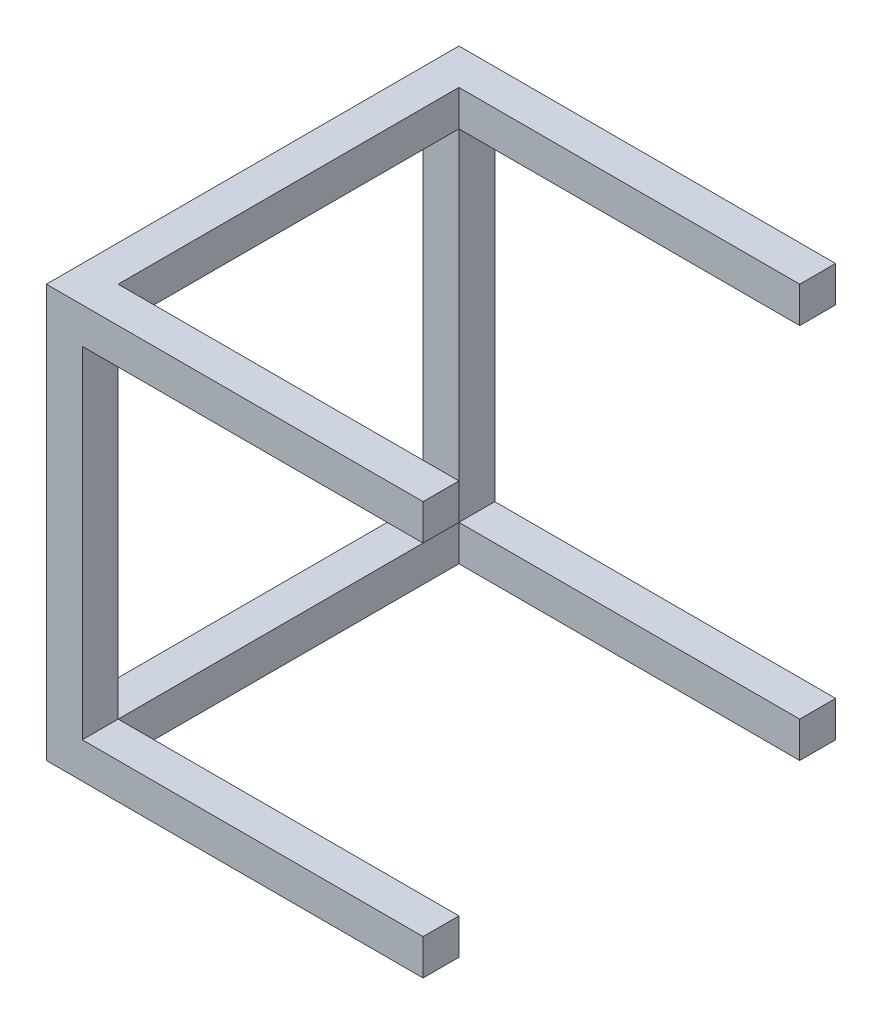
ISO-10303-21;
HEADER;
FILE_DESCRIPTION(('STEP AP214'),'2;1');
FILE_NAME('part.step','',(''),(''),'','','');
FILE_SCHEMA(('AUTOMOTIVE_DESIGN { 1 0 10303 214 1 1 1 1 }'));
ENDSEC;
DATA;
#1=APPLICATION_CONTEXT('core data for automotive mechanical design processes');
#2=APPLICATION_PROTOCOL_DEFINITION('international standard','automotive_design',2000,#1);
#3=PRODUCT_CONTEXT('',#1,'mechanical');
#4=PRODUCT('Part','Part','',(#3));
#5=PRODUCT_RELATED_PRODUCT_CATEGORY('part','',(#4));
#6=PRODUCT_DEFINITION_FORMATION('','',#4);
#7=PRODUCT_DEFINITION_CONTEXT('part definition',#1,'design');
#8=PRODUCT_DEFINITION('design','',#6,#7);
#9=PRODUCT_DEFINITION_SHAPE('','',#8);
#10=(LENGTH_UNIT() NAMED_UNIT(*) SI_UNIT(.MILLI.,.METRE.));
#11=(NAMED_UNIT(*) PLANE_ANGLE_UNIT() SI_UNIT($,.RADIAN.));
#12=(NAMED_UNIT(*) SI_UNIT($,.STERADIAN.) SOLID_ANGLE_UNIT());
#13=UNCERTAINTY_MEASURE_WITH_UNIT(LENGTH_MEASURE(1.E-05),#10,'distance_accuracy_value','');
#14=(GEOMETRIC_REPRESENTATION_CONTEXT(3) GLOBAL_UNCERTAINTY_ASSIGNED_CONTEXT((#13)) GLOBAL_UNIT_ASSIGNED_CONTEXT((#10,
#11,#12)) REPRESENTATION_CONTEXT('',''));
#15=CARTESIAN_POINT('',(0.,0.,0.));
#16=DIRECTION('',(0.,0.,1.));
#17=DIRECTION('',(1.,0.,0.));
#18=AXIS2_PLACEMENT_3D('',#15,#16,#17);
#19=CARTESIAN_POINT('',(40.,0.,0.));
#20=DIRECTION('',(-1.,0.,0.));
#21=DIRECTION('',(0.,0.,1.));
#22=AXIS2_PLACEMENT_3D('',#19,#20,#21);
#23=PLANE('',#22);
#24=DIRECTION('',(0.,1.,0.));
#25=VECTOR('',#24,1.);
#26=CARTESIAN_POINT('',(40.,25.5323898430656,-40.));
#27=LINE('',#26,#25);
#28=CARTESIAN_POINT('',(40.,25.5323898430656,-40.));
#29=VERTEX_POINT('',#28);
#30=CARTESIAN_POINT('',(40.,65.5323898430656,-40.));
#31=VERTEX_POINT('',#30);
#32=EDGE_CURVE('E181',#29,#31,#27,.T.);
#33=ORIENTED_EDGE('',*,*,#32,.F.);
#34=DIRECTION('',(0.,0.,-1.));
#35=VECTOR('',#34,1.);
#36=CARTESIAN_POINT('',(40.,25.5323898430656,0.));
#37=LINE('',#36,#35);
#38=CARTESIAN_POINT('',(40.,25.5323898430656,-420.));
#39=VERTEX_POINT('',#38);
#40=EDGE_CURVE('E165',#29,#39,#37,.T.);
#41=ORIENTED_EDGE('',*,*,#40,.T.);
#42=DIRECTION('',(0.,-1.,0.));
#43=VECTOR('',#42,1.);
#44=CARTESIAN_POINT('',(40.,25.5323898430656,-420.));
#45=LINE('',#44,#43);
#46=CARTESIAN_POINT('',(40.,65.5323898430656,-420.));
#47=VERTEX_POINT('',#46);
#48=EDGE_CURVE('E215',#47,#39,#45,.T.);
#49=ORIENTED_EDGE('',*,*,#48,.F.);
#50=DIRECTION('',(0.,0.,-1.));
#51=VECTOR('',#50,1.);
#52=CARTESIAN_POINT('',(40.,65.5323898430656,-40.));
#53=LINE('',#52,#51);
#54=EDGE_CURVE('E183',#31,#47,#53,.T.);
#55=ORIENTED_EDGE('',*,*,#54,.F.);
#56=EDGE_LOOP('',(#33,#41,#49,#55));
#57=FACE_BOUND('',#56,.T.);
#58=ADVANCED_FACE('F39',(#57),#23,.F.);
#59=DIRECTION('',(0.,0.,1.));
#60=VECTOR('',#59,1.);
#61=CARTESIAN_POINT('',(40.,65.5323898430656,0.));
#62=LINE('',#61,#60);
#63=CARTESIAN_POINT('',(40.,65.5323898430656,0.));
#64=VERTEX_POINT('',#63);
#65=EDGE_CURVE('E188',#31,#64,#62,.T.);
#66=ORIENTED_EDGE('',*,*,#65,.F.);
#67=DIRECTION('',(0.,-1.,0.));
#68=VECTOR('',#67,1.);
#69=CARTESIAN_POINT('',(40.,65.5323898430656,-40.));
#70=LINE('',#69,#68);
#71=CARTESIAN_POINT('',(40.,445.532389843066,-40.));
#72=VERTEX_POINT('',#71);
#73=EDGE_CURVE('E277',#72,#31,#70,.T.);
#74=ORIENTED_EDGE('',*,*,#73,.F.);
#75=DIRECTION('',(0.,0.,-1.));
#76=VECTOR('',#75,1.);
#77=CARTESIAN_POINT('',(40.,445.532389843066,0.));
#78=LINE('',#77,#76);
#79=CARTESIAN_POINT('',(40.,445.532389843066,0.));
#80=VERTEX_POINT('',#79);
#81=EDGE_CURVE('E244',#80,#72,#78,.T.);
#82=ORIENTED_EDGE('',*,*,#81,.F.);
#83=DIRECTION('',(0.,-1.,0.));
#84=VECTOR('',#83,1.);
#85=CARTESIAN_POINT('',(40.,25.5323898430656,0.));
#86=LINE('',#85,#84);
#87=EDGE_CURVE('E54',#80,#64,#86,.T.);
#88=ORIENTED_EDGE('',*,*,#87,.T.);
#89=EDGE_LOOP('',(#66,#74,#82,#88));
#90=FACE_BOUND('',#89,.T.);
#91=ADVANCED_FACE('F373',(#90),#23,.F.);
#92=DIRECTION('',(0.,0.,1.));
#93=VECTOR('',#92,1.);
#94=CARTESIAN_POINT('',(40.,65.5323898430656,-460.));
#95=LINE('',#94,#93);
#96=CARTESIAN_POINT('',(40.,65.5323898430656,-460.));
#97=VERTEX_POINT('',#96);
#98=EDGE_CURVE('E62',#97,#47,#95,.T.);
#99=ORIENTED_EDGE('',*,*,#98,.F.);
#100=DIRECTION('',(0.,1.,0.));
#101=VECTOR('',#100,1.);
#102=CARTESIAN_POINT('',(40.,25.5323898430656,-460.));
#103=LINE('',#102,#101);
#104=CARTESIAN_POINT('',(40.,445.532389843066,-460.));
#105=VERTEX_POINT('',#104);
#106=EDGE_CURVE('E309',#97,#105,#103,.T.);
#107=ORIENTED_EDGE('',*,*,#106,.T.);
#108=DIRECTION('',(0.,0.,-1.));
#109=VECTOR('',#108,1.);
#110=CARTESIAN_POINT('',(40.,445.532389843066,-460.));
#111=LINE('',#110,#109);
#112=CARTESIAN_POINT('',(40.,445.532389843066,-420.));
#113=VERTEX_POINT('',#112);
#114=EDGE_CURVE('E237',#113,#105,#111,.T.);
#115=ORIENTED_EDGE('',*,*,#114,.F.);
#116=DIRECTION('',(0.,1.,0.));
#117=VECTOR('',#116,1.);
#118=CARTESIAN_POINT('',(40.,65.5323898430656,-420.));
#119=LINE('',#118,#117);
#120=EDGE_CURVE('E282',#47,#113,#119,.T.);
#121=ORIENTED_EDGE('',*,*,#120,.F.);
#122=EDGE_LOOP('',(#99,#107,#115,#121));
#123=FACE_BOUND('',#122,.T.);
#124=ADVANCED_FACE('F356',(#123),#23,.F.);
#125=DIRECTION('',(0.,-1.,0.));
#126=VECTOR('',#125,1.);
#127=CARTESIAN_POINT('',(40.,485.532389843066,-420.));
#128=LINE('',#127,#126);
#129=CARTESIAN_POINT('',(40.,485.532389843066,-420.));
#130=VERTEX_POINT('',#129);
#131=EDGE_CURVE('E240',#130,#113,#128,.T.);
#132=ORIENTED_EDGE('',*,*,#131,.F.);
#133=DIRECTION('',(0.,0.,1.));
#134=VECTOR('',#133,1.);
#135=CARTESIAN_POINT('',(40.,485.532389843066,0.));
#136=LINE('',#135,#134);
#137=CARTESIAN_POINT('',(40.,485.532389843066,-40.));
#138=VERTEX_POINT('',#137);
#139=EDGE_CURVE('E311',#130,#138,#136,.T.);
#140=ORIENTED_EDGE('',*,*,#139,.T.);
#141=DIRECTION('',(0.,1.,0.));
#142=VECTOR('',#141,1.);
#143=CARTESIAN_POINT('',(40.,485.532389843066,-40.));
#144=LINE('',#143,#142);
#145=EDGE_CURVE('E256',#72,#138,#144,.T.);
#146=ORIENTED_EDGE('',*,*,#145,.F.);
#147=DIRECTION('',(0.,0.,1.));
#148=VECTOR('',#147,1.);
#149=CARTESIAN_POINT('',(40.,445.532389843066,-40.));
#150=LINE('',#149,#148);
#151=EDGE_CURVE('E285',#113,#72,#150,.T.);
#152=ORIENTED_EDGE('',*,*,#151,.F.);
#153=EDGE_LOOP('',(#132,#140,#146,#152));
#154=FACE_BOUND('',#153,.T.);
#155=ADVANCED_FACE('F375',(#154),#23,.F.);
#156=CARTESIAN_POINT('',(0.,0.,0.));
#157=DIRECTION('',(-1.,0.,0.));
#158=DIRECTION('',(0.,0.,1.));
#159=AXIS2_PLACEMENT_3D('',#156,#157,#158);
#160=PLANE('',#159);
#161=DIRECTION('',(0.,1.,0.));
#162=VECTOR('',#161,1.);
#163=CARTESIAN_POINT('',(0.,25.5323898430656,-460.));
#164=LINE('',#163,#162);
#165=CARTESIAN_POINT('',(0.,25.5323898430656,-460.));
#166=VERTEX_POINT('',#165);
#167=CARTESIAN_POINT('',(0.,485.532389843066,-460.));
#168=VERTEX_POINT('',#167);
#169=EDGE_CURVE('E308',#166,#168,#164,.T.);
#170=ORIENTED_EDGE('',*,*,#169,.F.);
#171=DIRECTION('',(0.,0.,-1.));
#172=VECTOR('',#171,1.);
#173=CARTESIAN_POINT('',(0.,25.5323898430656,0.));
#174=LINE('',#173,#172);
#175=CARTESIAN_POINT('',(0.,25.5323898430656,0.));
#176=VERTEX_POINT('',#175);
#177=EDGE_CURVE('E312',#176,#166,#174,.T.);
#178=ORIENTED_EDGE('',*,*,#177,.F.);
#179=DIRECTION('',(0.,-1.,0.));
#180=VECTOR('',#179,1.);
#181=CARTESIAN_POINT('',(0.,25.5323898430656,0.));
#182=LINE('',#181,#180);
#183=CARTESIAN_POINT('',(0.,485.532389843066,0.));
#184=VERTEX_POINT('',#183);
#185=EDGE_CURVE('E319',#184,#176,#182,.T.);
#186=ORIENTED_EDGE('',*,*,#185,.F.);
#187=DIRECTION('',(0.,0.,1.));
#188=VECTOR('',#187,1.);
#189=CARTESIAN_POINT('',(0.,485.532389843066,0.));
#190=LINE('',#189,#188);
#191=EDGE_CURVE('E317',#168,#184,#190,.T.);
#192=ORIENTED_EDGE('',*,*,#191,.F.);
#193=EDGE_LOOP('',(#170,#178,#186,#192));
#194=FACE_BOUND('',#193,.T.);
#195=DIRECTION('',(0.,0.,1.));
#196=VECTOR('',#195,1.);
#197=CARTESIAN_POINT('',(0.,445.532389843066,-40.));
#198=LINE('',#197,#196);
#199=CARTESIAN_POINT('',(0.,445.532389843066,-420.));
#200=VERTEX_POINT('',#199);
#201=CARTESIAN_POINT('',(0.,445.532389843066,-40.));
#202=VERTEX_POINT('',#201);
#203=EDGE_CURVE('E280',#200,#202,#198,.T.);
#204=ORIENTED_EDGE('',*,*,#203,.T.);
#205=DIRECTION('',(0.,-1.,0.));
#206=VECTOR('',#205,1.);
#207=CARTESIAN_POINT('',(0.,65.5323898430656,-40.));
#208=LINE('',#207,#206);
#209=CARTESIAN_POINT('',(0.,65.5323898430656,-40.));
#210=VERTEX_POINT('',#209);
#211=EDGE_CURVE('E276',#202,#210,#208,.T.);
#212=ORIENTED_EDGE('',*,*,#211,.T.);
#213=DIRECTION('',(0.,0.,-1.));
#214=VECTOR('',#213,1.);
#215=CARTESIAN_POINT('',(0.,65.5323898430656,-40.));
#216=LINE('',#215,#214);
#217=CARTESIAN_POINT('',(0.,65.5323898430656,-420.));
#218=VERTEX_POINT('',#217);
#219=EDGE_CURVE('E291',#210,#218,#216,.T.);
#220=ORIENTED_EDGE('',*,*,#219,.T.);
#221=DIRECTION('',(0.,1.,0.));
#222=VECTOR('',#221,1.);
#223=CARTESIAN_POINT('',(0.,65.5323898430656,-420.));
#224=LINE('',#223,#222);
#225=EDGE_CURVE('E294',#218,#200,#224,.T.);
#226=ORIENTED_EDGE('',*,*,#225,.T.);
#227=EDGE_LOOP('',(#204,#212,#220,#226));
#228=FACE_BOUND('',#227,.T.);
#229=ADVANCED_FACE('F337',(#194,#228),#160,.T.);
#230=CARTESIAN_POINT('',(40.,25.5323898430656,-460.));
#231=DIRECTION('',(0.,0.,1.));
#232=DIRECTION('',(1.,0.,0.));
#233=AXIS2_PLACEMENT_3D('',#230,#231,#232);
#234=PLANE('',#233);
#235=ORIENTED_EDGE('',*,*,#169,.T.);
#236=DIRECTION('',(-1.,0.,0.));
#237=VECTOR('',#236,1.);
#238=CARTESIAN_POINT('',(40.,485.532389843066,-460.));
#239=LINE('',#238,#237);
#240=CARTESIAN_POINT('',(420.,485.532389843066,-460.));
#241=VERTEX_POINT('',#240);
#242=EDGE_CURVE('E11',#241,#168,#239,.T.);
#243=ORIENTED_EDGE('',*,*,#242,.F.);
#244=DIRECTION('',(0.,1.,0.));
#245=VECTOR('',#244,1.);
#246=CARTESIAN_POINT('',(420.,485.532389843066,-460.));
#247=LINE('',#246,#245);
#248=CARTESIAN_POINT('',(420.,445.532389843066,-460.));
#249=VERTEX_POINT('',#248);
#250=EDGE_CURVE('E241',#249,#241,#247,.T.);
#251=ORIENTED_EDGE('',*,*,#250,.F.);
#252=DIRECTION('',(-1.,0.,0.));
#253=VECTOR('',#252,1.);
#254=CARTESIAN_POINT('',(420.,445.532389843066,-460.));
#255=LINE('',#254,#253);
#256=EDGE_CURVE('E233',#249,#105,#255,.T.);
#257=ORIENTED_EDGE('',*,*,#256,.T.);
#258=ORIENTED_EDGE('',*,*,#106,.F.);
#259=DIRECTION('',(-1.,0.,0.));
#260=VECTOR('',#259,1.);
#261=CARTESIAN_POINT('',(420.,65.5323898430656,-460.));
#262=LINE('',#261,#260);
#263=CARTESIAN_POINT('',(420.,65.5323898430656,-460.));
#264=VERTEX_POINT('',#263);
#265=EDGE_CURVE('E187',#264,#97,#262,.T.);
#266=ORIENTED_EDGE('',*,*,#265,.F.);
#267=DIRECTION('',(0.,1.,0.));
#268=VECTOR('',#267,1.);
#269=CARTESIAN_POINT('',(420.,25.5323898430656,-460.));
#270=LINE('',#269,#268);
#271=CARTESIAN_POINT('',(420.,25.5323898430656,-460.));
#272=VERTEX_POINT('',#271);
#273=EDGE_CURVE('E217',#272,#264,#270,.T.);
#274=ORIENTED_EDGE('',*,*,#273,.F.);
#275=DIRECTION('',(-1.,0.,0.));
#276=VECTOR('',#275,1.);
#277=CARTESIAN_POINT('',(40.,25.5323898430656,-460.));
#278=LINE('',#277,#276);
#279=EDGE_CURVE('E177',#272,#166,#278,.T.);
#280=ORIENTED_EDGE('',*,*,#279,.T.);
#281=EDGE_LOOP('',(#235,#243,#251,#257,#258,#266,#274,#280));
#282=FACE_BOUND('',#281,.T.);
#283=ADVANCED_FACE('F41',(#282),#234,.F.);
#284=CARTESIAN_POINT('',(40.,485.532389843066,0.));
#285=DIRECTION('',(0.,-1.,0.));
#286=DIRECTION('',(0.,0.,-1.));
#287=AXIS2_PLACEMENT_3D('',#284,#285,#286);
#288=PLANE('',#287);
#289=ORIENTED_EDGE('',*,*,#191,.T.);
#290=DIRECTION('',(-1.,0.,0.));
#291=VECTOR('',#290,1.);
#292=CARTESIAN_POINT('',(40.,485.532389843066,0.));
#293=LINE('',#292,#291);
#294=CARTESIAN_POINT('',(420.,485.532389843066,0.));
#295=VERTEX_POINT('',#294);
#296=EDGE_CURVE('E47',#295,#184,#293,.T.);
#297=ORIENTED_EDGE('',*,*,#296,.F.);
#298=DIRECTION('',(0.,0.,1.));
#299=VECTOR('',#298,1.);
#300=CARTESIAN_POINT('',(420.,485.532389843066,0.));
#301=LINE('',#300,#299);
#302=CARTESIAN_POINT('',(420.,485.532389843066,-40.));
#303=VERTEX_POINT('',#302);
#304=EDGE_CURVE('E260',#303,#295,#301,.T.);
#305=ORIENTED_EDGE('',*,*,#304,.F.);
#306=DIRECTION('',(-1.,0.,0.));
#307=VECTOR('',#306,1.);
#308=CARTESIAN_POINT('',(420.,485.532389843066,-40.));
#309=LINE('',#308,#307);
#310=EDGE_CURVE('E263',#303,#138,#309,.T.);
#311=ORIENTED_EDGE('',*,*,#310,.T.);
#312=ORIENTED_EDGE('',*,*,#139,.F.);
#313=DIRECTION('',(-1.,0.,0.));
#314=VECTOR('',#313,1.);
#315=CARTESIAN_POINT('',(420.,485.532389843066,-420.));
#316=LINE('',#315,#314);
#317=CARTESIAN_POINT('',(420.,485.532389843066,-420.));
#318=VERTEX_POINT('',#317);
#319=EDGE_CURVE('E219',#318,#130,#316,.T.);
#320=ORIENTED_EDGE('',*,*,#319,.F.);
#321=DIRECTION('',(0.,0.,1.));
#322=VECTOR('',#321,1.);
#323=CARTESIAN_POINT('',(420.,485.532389843066,-460.));
#324=LINE('',#323,#322);
#325=EDGE_CURVE('E248',#241,#318,#324,.T.);
#326=ORIENTED_EDGE('',*,*,#325,.F.);
#327=ORIENTED_EDGE('',*,*,#242,.T.);
#328=EDGE_LOOP('',(#289,#297,#305,#311,#312,#320,#326,#327));
#329=FACE_BOUND('',#328,.T.);
#330=ADVANCED_FACE('F395',(#329),#288,.F.);
#331=CARTESIAN_POINT('',(40.,25.5323898430656,0.));
#332=DIRECTION('',(0.,0.,-1.));
#333=DIRECTION('',(-1.,0.,0.));
#334=AXIS2_PLACEMENT_3D('',#331,#332,#333);
#335=PLANE('',#334);
#336=ORIENTED_EDGE('',*,*,#185,.T.);
#337=DIRECTION('',(-1.,0.,0.));
#338=VECTOR('',#337,1.);
#339=CARTESIAN_POINT('',(40.,25.5323898430656,0.));
#340=LINE('',#339,#338);
#341=CARTESIAN_POINT('',(420.,25.5323898430656,0.));
#342=VERTEX_POINT('',#341);
#343=EDGE_CURVE('E324',#342,#176,#340,.T.);
#344=ORIENTED_EDGE('',*,*,#343,.F.);
#345=DIRECTION('',(0.,-1.,0.));
#346=VECTOR('',#345,1.);
#347=CARTESIAN_POINT('',(420.,25.5323898430656,0.));
#348=LINE('',#347,#346);
#349=CARTESIAN_POINT('',(420.,65.5323898430656,0.));
#350=VERTEX_POINT('',#349);
#351=EDGE_CURVE('E200',#350,#342,#348,.T.);
#352=ORIENTED_EDGE('',*,*,#351,.F.);
#353=DIRECTION('',(-1.,0.,0.));
#354=VECTOR('',#353,1.);
#355=CARTESIAN_POINT('',(420.,65.5323898430656,0.));
#356=LINE('',#355,#354);
#357=EDGE_CURVE('E194',#350,#64,#356,.T.);
#358=ORIENTED_EDGE('',*,*,#357,.T.);
#359=ORIENTED_EDGE('',*,*,#87,.F.);
#360=DIRECTION('',(-1.,0.,0.));
#361=VECTOR('',#360,1.);
#362=CARTESIAN_POINT('',(420.,445.532389843066,0.));
#363=LINE('',#362,#361);
#364=CARTESIAN_POINT('',(420.,445.532389843066,0.));
#365=VERTEX_POINT('',#364);
#366=EDGE_CURVE('E273',#365,#80,#363,.T.);
#367=ORIENTED_EDGE('',*,*,#366,.F.);
#368=DIRECTION('',(0.,-1.,0.));
#369=VECTOR('',#368,1.);
#370=CARTESIAN_POINT('',(420.,485.532389843066,0.));
#371=LINE('',#370,#369);
#372=EDGE_CURVE('E252',#295,#365,#371,.T.);
#373=ORIENTED_EDGE('',*,*,#372,.F.);
#374=ORIENTED_EDGE('',*,*,#296,.T.);
#375=EDGE_LOOP('',(#336,#344,#352,#358,#359,#367,#373,#374));
#376=FACE_BOUND('',#375,.T.);
#377=ADVANCED_FACE('F330',(#376),#335,.F.);
#378=CARTESIAN_POINT('',(40.,25.5323898430656,0.));
#379=DIRECTION('',(0.,1.,0.));
#380=DIRECTION('',(0.,0.,1.));
#381=AXIS2_PLACEMENT_3D('',#378,#379,#380);
#382=PLANE('',#381);
#383=ORIENTED_EDGE('',*,*,#177,.T.);
#384=ORIENTED_EDGE('',*,*,#279,.F.);
#385=DIRECTION('',(0.,0.,-1.));
#386=VECTOR('',#385,1.);
#387=CARTESIAN_POINT('',(420.,25.5323898430656,-460.));
#388=LINE('',#387,#386);
#389=CARTESIAN_POINT('',(420.,25.5323898430656,-420.));
#390=VERTEX_POINT('',#389);
#391=EDGE_CURVE('E214',#390,#272,#388,.T.);
#392=ORIENTED_EDGE('',*,*,#391,.F.);
#393=DIRECTION('',(-1.,0.,0.));
#394=VECTOR('',#393,1.);
#395=CARTESIAN_POINT('',(420.,25.5323898430656,-420.));
#396=LINE('',#395,#394);
#397=EDGE_CURVE('E174',#390,#39,#396,.T.);
#398=ORIENTED_EDGE('',*,*,#397,.T.);
#399=ORIENTED_EDGE('',*,*,#40,.F.);
#400=DIRECTION('',(-1.,0.,0.));
#401=VECTOR('',#400,1.);
#402=CARTESIAN_POINT('',(420.,25.5323898430656,-40.));
#403=LINE('',#402,#401);
#404=CARTESIAN_POINT('',(420.,25.5323898430656,-40.));
#405=VERTEX_POINT('',#404);
#406=EDGE_CURVE('E170',#405,#29,#403,.T.);
#407=ORIENTED_EDGE('',*,*,#406,.F.);
#408=DIRECTION('',(0.,0.,-1.));
#409=VECTOR('',#408,1.);
#410=CARTESIAN_POINT('',(420.,25.5323898430656,0.));
#411=LINE('',#410,#409);
#412=EDGE_CURVE('E204',#342,#405,#411,.T.);
#413=ORIENTED_EDGE('',*,*,#412,.F.);
#414=ORIENTED_EDGE('',*,*,#343,.T.);
#415=EDGE_LOOP('',(#383,#384,#392,#398,#399,#407,#413,#414));
#416=FACE_BOUND('',#415,.T.);
#417=ADVANCED_FACE('F167',(#416),#382,.F.);
#418=CARTESIAN_POINT('',(40.,65.5323898430656,-40.));
#419=DIRECTION('',(0.,0.,-1.));
#420=DIRECTION('',(-1.,0.,0.));
#421=AXIS2_PLACEMENT_3D('',#418,#419,#420);
#422=PLANE('',#421);
#423=ORIENTED_EDGE('',*,*,#211,.F.);
#424=DIRECTION('',(-1.,0.,0.));
#425=VECTOR('',#424,1.);
#426=CARTESIAN_POINT('',(40.,445.532389843066,-40.));
#427=LINE('',#426,#425);
#428=EDGE_CURVE('E288',#72,#202,#427,.T.);
#429=ORIENTED_EDGE('',*,*,#428,.F.);
#430=ORIENTED_EDGE('',*,*,#73,.T.);
#431=DIRECTION('',(-1.,0.,0.));
#432=VECTOR('',#431,1.);
#433=CARTESIAN_POINT('',(40.,65.5323898430656,-40.));
#434=LINE('',#433,#432);
#435=EDGE_CURVE('E305',#31,#210,#434,.T.);
#436=ORIENTED_EDGE('',*,*,#435,.T.);
#437=EDGE_LOOP('',(#423,#429,#430,#436));
#438=FACE_BOUND('',#437,.T.);
#439=ADVANCED_FACE('F410',(#438),#422,.T.);
#440=CARTESIAN_POINT('',(40.,65.5323898430656,-40.));
#441=DIRECTION('',(0.,1.,0.));
#442=DIRECTION('',(0.,0.,1.));
#443=AXIS2_PLACEMENT_3D('',#440,#441,#442);
#444=PLANE('',#443);
#445=ORIENTED_EDGE('',*,*,#219,.F.);
#446=ORIENTED_EDGE('',*,*,#435,.F.);
#447=ORIENTED_EDGE('',*,*,#54,.T.);
#448=DIRECTION('',(-1.,0.,0.));
#449=VECTOR('',#448,1.);
#450=CARTESIAN_POINT('',(40.,65.5323898430656,-420.));
#451=LINE('',#450,#449);
#452=EDGE_CURVE('E303',#47,#218,#451,.T.);
#453=ORIENTED_EDGE('',*,*,#452,.T.);
#454=EDGE_LOOP('',(#445,#446,#447,#453));
#455=FACE_BOUND('',#454,.T.);
#456=ADVANCED_FACE('F351',(#455),#444,.T.);
#457=CARTESIAN_POINT('',(40.,65.5323898430656,-420.));
#458=DIRECTION('',(0.,0.,1.));
#459=DIRECTION('',(1.,0.,0.));
#460=AXIS2_PLACEMENT_3D('',#457,#458,#459);
#461=PLANE('',#460);
#462=ORIENTED_EDGE('',*,*,#225,.F.);
#463=ORIENTED_EDGE('',*,*,#452,.F.);
#464=ORIENTED_EDGE('',*,*,#120,.T.);
#465=DIRECTION('',(-1.,0.,0.));
#466=VECTOR('',#465,1.);
#467=CARTESIAN_POINT('',(40.,445.532389843066,-420.));
#468=LINE('',#467,#466);
#469=EDGE_CURVE('E301',#113,#200,#468,.T.);
#470=ORIENTED_EDGE('',*,*,#469,.T.);
#471=EDGE_LOOP('',(#462,#463,#464,#470));
#472=FACE_BOUND('',#471,.T.);
#473=ADVANCED_FACE('F354',(#472),#461,.T.);
#474=CARTESIAN_POINT('',(40.,445.532389843066,-40.));
#475=DIRECTION('',(0.,-1.,0.));
#476=DIRECTION('',(0.,0.,-1.));
#477=AXIS2_PLACEMENT_3D('',#474,#475,#476);
#478=PLANE('',#477);
#479=ORIENTED_EDGE('',*,*,#203,.F.);
#480=ORIENTED_EDGE('',*,*,#469,.F.);
#481=ORIENTED_EDGE('',*,*,#151,.T.);
#482=ORIENTED_EDGE('',*,*,#428,.T.);
#483=EDGE_LOOP('',(#479,#480,#481,#482));
#484=FACE_BOUND('',#483,.T.);
#485=ADVANCED_FACE('F413',(#484),#478,.T.);
#486=CARTESIAN_POINT('',(420.,445.532389843066,0.));
#487=DIRECTION('',(0.,1.,0.));
#488=DIRECTION('',(0.,0.,1.));
#489=AXIS2_PLACEMENT_3D('',#486,#487,#488);
#490=PLANE('',#489);
#491=ORIENTED_EDGE('',*,*,#81,.T.);
#492=DIRECTION('',(-1.,0.,0.));
#493=VECTOR('',#492,1.);
#494=CARTESIAN_POINT('',(420.,445.532389843066,-40.));
#495=LINE('',#494,#493);
#496=CARTESIAN_POINT('',(420.,445.532389843066,-40.));
#497=VERTEX_POINT('',#496);
#498=EDGE_CURVE('E270',#497,#72,#495,.T.);
#499=ORIENTED_EDGE('',*,*,#498,.F.);
#500=DIRECTION('',(0.,0.,-1.));
#501=VECTOR('',#500,1.);
#502=CARTESIAN_POINT('',(420.,445.532389843066,0.));
#503=LINE('',#502,#501);
#504=EDGE_CURVE('E255',#365,#497,#503,.T.);
#505=ORIENTED_EDGE('',*,*,#504,.F.);
#506=ORIENTED_EDGE('',*,*,#366,.T.);
#507=EDGE_LOOP('',(#491,#499,#505,#506));
#508=FACE_BOUND('',#507,.T.);
#509=ADVANCED_FACE('F402',(#508),#490,.F.);
#510=CARTESIAN_POINT('',(420.,485.532389843066,-40.));
#511=DIRECTION('',(0.,0.,1.));
#512=DIRECTION('',(1.,0.,0.));
#513=AXIS2_PLACEMENT_3D('',#510,#511,#512);
#514=PLANE('',#513);
#515=ORIENTED_EDGE('',*,*,#145,.T.);
#516=ORIENTED_EDGE('',*,*,#310,.F.);
#517=DIRECTION('',(0.,1.,0.));
#518=VECTOR('',#517,1.);
#519=CARTESIAN_POINT('',(420.,485.532389843066,-40.));
#520=LINE('',#519,#518);
#521=EDGE_CURVE('E258',#497,#303,#520,.T.);
#522=ORIENTED_EDGE('',*,*,#521,.F.);
#523=ORIENTED_EDGE('',*,*,#498,.T.);
#524=EDGE_LOOP('',(#515,#516,#522,#523));
#525=FACE_BOUND('',#524,.T.);
#526=ADVANCED_FACE('F399',(#525),#514,.F.);
#527=CARTESIAN_POINT('',(420.,0.,0.));
#528=DIRECTION('',(1.,0.,0.));
#529=DIRECTION('',(0.,0.,-1.));
#530=AXIS2_PLACEMENT_3D('',#527,#528,#529);
#531=PLANE('',#530);
#532=ORIENTED_EDGE('',*,*,#372,.T.);
#533=ORIENTED_EDGE('',*,*,#504,.T.);
#534=ORIENTED_EDGE('',*,*,#521,.T.);
#535=ORIENTED_EDGE('',*,*,#304,.T.);
#536=EDGE_LOOP('',(#532,#533,#534,#535));
#537=FACE_BOUND('',#536,.T.);
#538=ADVANCED_FACE('F564',(#537),#531,.T.);
#539=CARTESIAN_POINT('',(420.,485.532389843066,-420.));
#540=DIRECTION('',(0.,0.,-1.));
#541=DIRECTION('',(-1.,0.,0.));
#542=AXIS2_PLACEMENT_3D('',#539,#540,#541);
#543=PLANE('',#542);
#544=ORIENTED_EDGE('',*,*,#131,.T.);
#545=DIRECTION('',(-1.,0.,0.));
#546=VECTOR('',#545,1.);
#547=CARTESIAN_POINT('',(420.,445.532389843066,-420.));
#548=LINE('',#547,#546);
#549=CARTESIAN_POINT('',(420.,445.532389843066,-420.));
#550=VERTEX_POINT('',#549);
#551=EDGE_CURVE('E230',#550,#113,#548,.T.);
#552=ORIENTED_EDGE('',*,*,#551,.F.);
#553=DIRECTION('',(0.,-1.,0.));
#554=VECTOR('',#553,1.);
#555=CARTESIAN_POINT('',(420.,485.532389843066,-420.));
#556=LINE('',#555,#554);
#557=EDGE_CURVE('E246',#318,#550,#556,.T.);
#558=ORIENTED_EDGE('',*,*,#557,.F.);
#559=ORIENTED_EDGE('',*,*,#319,.T.);
#560=EDGE_LOOP('',(#544,#552,#558,#559));
#561=FACE_BOUND('',#560,.T.);
#562=ADVANCED_FACE('F393',(#561),#543,.F.);
#563=CARTESIAN_POINT('',(420.,445.532389843066,-460.));
#564=DIRECTION('',(0.,1.,0.));
#565=DIRECTION('',(0.,0.,1.));
#566=AXIS2_PLACEMENT_3D('',#563,#564,#565);
#567=PLANE('',#566);
#568=ORIENTED_EDGE('',*,*,#114,.T.);
#569=ORIENTED_EDGE('',*,*,#256,.F.);
#570=DIRECTION('',(0.,0.,-1.));
#571=VECTOR('',#570,1.);
#572=CARTESIAN_POINT('',(420.,445.532389843066,-460.));
#573=LINE('',#572,#571);
#574=EDGE_CURVE('E236',#550,#249,#573,.T.);
#575=ORIENTED_EDGE('',*,*,#574,.F.);
#576=ORIENTED_EDGE('',*,*,#551,.T.);
#577=EDGE_LOOP('',(#568,#569,#575,#576));
#578=FACE_BOUND('',#577,.T.);
#579=ADVANCED_FACE('F368',(#578),#567,.F.);
#580=CARTESIAN_POINT('',(420.,0.,0.));
#581=DIRECTION('',(-1.,0.,0.));
#582=DIRECTION('',(0.,0.,1.));
#583=AXIS2_PLACEMENT_3D('',#580,#581,#582);
#584=PLANE('',#583);
#585=ORIENTED_EDGE('',*,*,#250,.T.);
#586=ORIENTED_EDGE('',*,*,#325,.T.);
#587=ORIENTED_EDGE('',*,*,#557,.T.);
#588=ORIENTED_EDGE('',*,*,#574,.T.);
#589=EDGE_LOOP('',(#585,#586,#587,#588));
#590=FACE_BOUND('',#589,.T.);
#591=ADVANCED_FACE('F361',(#590),#584,.F.);
#592=CARTESIAN_POINT('',(420.,65.5323898430656,-460.));
#593=DIRECTION('',(0.,-1.,0.));
#594=DIRECTION('',(0.,0.,-1.));
#595=AXIS2_PLACEMENT_3D('',#592,#593,#594);
#596=PLANE('',#595);
#597=ORIENTED_EDGE('',*,*,#98,.T.);
#598=DIRECTION('',(-1.,0.,0.));
#599=VECTOR('',#598,1.);
#600=CARTESIAN_POINT('',(420.,65.5323898430656,-420.));
#601=LINE('',#600,#599);
#602=CARTESIAN_POINT('',(420.,65.5323898430656,-420.));
#603=VERTEX_POINT('',#602);
#604=EDGE_CURVE('E210',#603,#47,#601,.T.);
#605=ORIENTED_EDGE('',*,*,#604,.F.);
#606=DIRECTION('',(0.,0.,1.));
#607=VECTOR('',#606,1.);
#608=CARTESIAN_POINT('',(420.,65.5323898430656,-460.));
#609=LINE('',#608,#607);
#610=EDGE_CURVE('E224',#264,#603,#609,.T.);
#611=ORIENTED_EDGE('',*,*,#610,.F.);
#612=ORIENTED_EDGE('',*,*,#265,.T.);
#613=EDGE_LOOP('',(#597,#605,#611,#612));
#614=FACE_BOUND('',#613,.T.);
#615=ADVANCED_FACE('F359',(#614),#596,.F.);
#616=CARTESIAN_POINT('',(420.,25.5323898430656,-420.));
#617=DIRECTION('',(0.,0.,-1.));
#618=DIRECTION('',(-1.,0.,0.));
#619=AXIS2_PLACEMENT_3D('',#616,#617,#618);
#620=PLANE('',#619);
#621=ORIENTED_EDGE('',*,*,#48,.T.);
#622=ORIENTED_EDGE('',*,*,#397,.F.);
#623=DIRECTION('',(0.,-1.,0.));
#624=VECTOR('',#623,1.);
#625=CARTESIAN_POINT('',(420.,25.5323898430656,-420.));
#626=LINE('',#625,#624);
#627=EDGE_CURVE('E222',#603,#390,#626,.T.);
#628=ORIENTED_EDGE('',*,*,#627,.F.);
#629=ORIENTED_EDGE('',*,*,#604,.T.);
#630=EDGE_LOOP('',(#621,#622,#628,#629));
#631=FACE_BOUND('',#630,.T.);
#632=ADVANCED_FACE('F347',(#631),#620,.F.);
#633=CARTESIAN_POINT('',(420.,0.,0.));
#634=DIRECTION('',(1.,0.,0.));
#635=DIRECTION('',(0.,0.,-1.));
#636=AXIS2_PLACEMENT_3D('',#633,#634,#635);
#637=PLANE('',#636);
#638=ORIENTED_EDGE('',*,*,#273,.T.);
#639=ORIENTED_EDGE('',*,*,#610,.T.);
#640=ORIENTED_EDGE('',*,*,#627,.T.);
#641=ORIENTED_EDGE('',*,*,#391,.T.);
#642=EDGE_LOOP('',(#638,#639,#640,#641));
#643=FACE_BOUND('',#642,.T.);
#644=ADVANCED_FACE('F343',(#643),#637,.T.);
#645=CARTESIAN_POINT('',(420.,25.5323898430656,-40.));
#646=DIRECTION('',(0.,0.,1.));
#647=DIRECTION('',(1.,0.,0.));
#648=AXIS2_PLACEMENT_3D('',#645,#646,#647);
#649=PLANE('',#648);
#650=ORIENTED_EDGE('',*,*,#32,.T.);
#651=DIRECTION('',(-1.,0.,0.));
#652=VECTOR('',#651,1.);
#653=CARTESIAN_POINT('',(420.,65.5323898430656,-40.));
#654=LINE('',#653,#652);
#655=CARTESIAN_POINT('',(420.,65.5323898430656,-40.));
#656=VERTEX_POINT('',#655);
#657=EDGE_CURVE('E192',#656,#31,#654,.T.);
#658=ORIENTED_EDGE('',*,*,#657,.F.);
#659=DIRECTION('',(0.,1.,0.));
#660=VECTOR('',#659,1.);
#661=CARTESIAN_POINT('',(420.,25.5323898430656,-40.));
#662=LINE('',#661,#660);
#663=EDGE_CURVE('E191',#405,#656,#662,.T.);
#664=ORIENTED_EDGE('',*,*,#663,.F.);
#665=ORIENTED_EDGE('',*,*,#406,.T.);
#666=EDGE_LOOP('',(#650,#658,#664,#665));
#667=FACE_BOUND('',#666,.T.);
#668=ADVANCED_FACE('F190',(#667),#649,.F.);
#669=CARTESIAN_POINT('',(420.,65.5323898430656,0.));
#670=DIRECTION('',(0.,-1.,0.));
#671=DIRECTION('',(0.,0.,-1.));
#672=AXIS2_PLACEMENT_3D('',#669,#670,#671);
#673=PLANE('',#672);
#674=ORIENTED_EDGE('',*,*,#65,.T.);
#675=ORIENTED_EDGE('',*,*,#357,.F.);
#676=DIRECTION('',(0.,0.,1.));
#677=VECTOR('',#676,1.);
#678=CARTESIAN_POINT('',(420.,65.5323898430656,0.));
#679=LINE('',#678,#677);
#680=EDGE_CURVE('E199',#656,#350,#679,.T.);
#681=ORIENTED_EDGE('',*,*,#680,.F.);
#682=ORIENTED_EDGE('',*,*,#657,.T.);
#683=EDGE_LOOP('',(#674,#675,#681,#682));
#684=FACE_BOUND('',#683,.T.);
#685=ADVANCED_FACE('F408',(#684),#673,.F.);
#686=CARTESIAN_POINT('',(420.,0.,0.));
#687=DIRECTION('',(-1.,0.,0.));
#688=DIRECTION('',(0.,0.,1.));
#689=AXIS2_PLACEMENT_3D('',#686,#687,#688);
#690=PLANE('',#689);
#691=ORIENTED_EDGE('',*,*,#351,.T.);
#692=ORIENTED_EDGE('',*,*,#412,.T.);
#693=ORIENTED_EDGE('',*,*,#663,.T.);
#694=ORIENTED_EDGE('',*,*,#680,.T.);
#695=EDGE_LOOP('',(#691,#692,#693,#694));
#696=FACE_BOUND('',#695,.T.);
#697=ADVANCED_FACE('F640',(#696),#690,.F.);
#698=CLOSED_SHELL('',(#58,#91,#124,#155,#229,#283,#330,#377,#417,#439,#456,#473,#485,#509,#526,
#538,#562,#579,#591,#615,#632,#644,#668,#685,#697));
#699=MANIFOLD_SOLID_BREP('B2',#698);
#700=ADVANCED_BREP_SHAPE_REPRESENTATION('',(#18,#699),#14);
#701=SHAPE_DEFINITION_REPRESENTATION(#9,#700);
ENDSEC;
END-ISO-10303-21;
